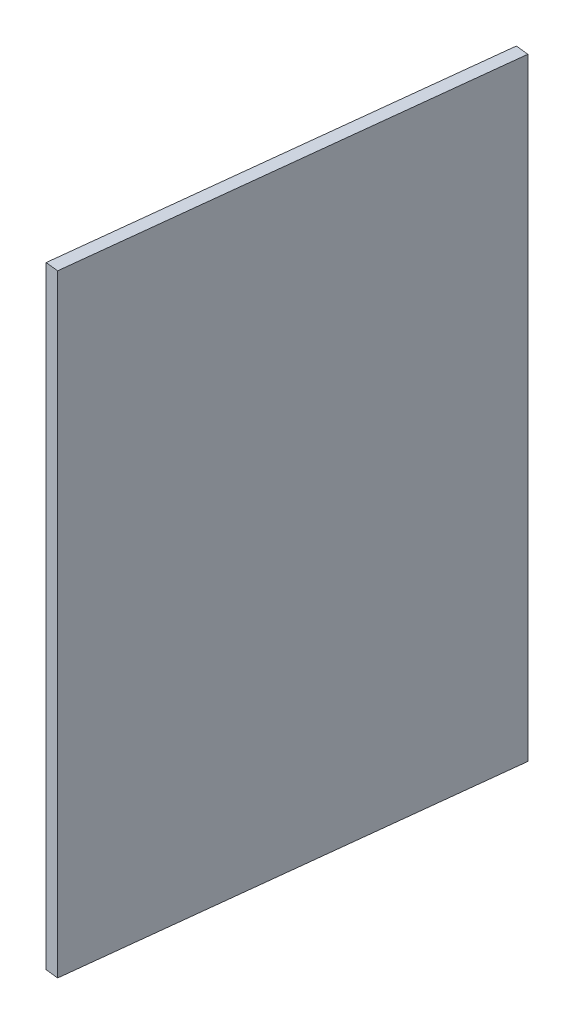
ISO-10303-21;
HEADER;
FILE_DESCRIPTION(('STEP AP214'),'2;1');
FILE_NAME('part.step','',(''),(''),'','','');
FILE_SCHEMA(('AUTOMOTIVE_DESIGN { 1 0 10303 214 1 1 1 1 }'));
ENDSEC;
DATA;
#1=APPLICATION_CONTEXT('core data for automotive mechanical design processes');
#2=APPLICATION_PROTOCOL_DEFINITION('international standard','automotive_design',2000,#1);
#3=PRODUCT_CONTEXT('',#1,'mechanical');
#4=PRODUCT('Part','Part','',(#3));
#5=PRODUCT_RELATED_PRODUCT_CATEGORY('part','',(#4));
#6=PRODUCT_DEFINITION_FORMATION('','',#4);
#7=PRODUCT_DEFINITION_CONTEXT('part definition',#1,'design');
#8=PRODUCT_DEFINITION('design','',#6,#7);
#9=PRODUCT_DEFINITION_SHAPE('','',#8);
#10=(LENGTH_UNIT() NAMED_UNIT(*) SI_UNIT(.MILLI.,.METRE.));
#11=(NAMED_UNIT(*) PLANE_ANGLE_UNIT() SI_UNIT($,.RADIAN.));
#12=(NAMED_UNIT(*) SI_UNIT($,.STERADIAN.) SOLID_ANGLE_UNIT());
#13=UNCERTAINTY_MEASURE_WITH_UNIT(LENGTH_MEASURE(1.E-05),#10,'distance_accuracy_value','');
#14=(GEOMETRIC_REPRESENTATION_CONTEXT(3) GLOBAL_UNCERTAINTY_ASSIGNED_CONTEXT((#13)) GLOBAL_UNIT_ASSIGNED_CONTEXT((#10,
#11,#12)) REPRESENTATION_CONTEXT('',''));
#15=CARTESIAN_POINT('',(0.,0.,0.));
#16=DIRECTION('',(0.,0.,1.));
#17=DIRECTION('',(1.,0.,0.));
#18=AXIS2_PLACEMENT_3D('',#15,#16,#17);
#19=CARTESIAN_POINT('',(9.63164156960607,0.,67.751071337531));
#20=DIRECTION('',(-0.993723873054748,0.,-0.111860914179491));
#21=DIRECTION('',(-0.111860914179491,0.,0.993723873054748));
#22=AXIS2_PLACEMENT_3D('',#19,#20,#21);
#23=PLANE('',#22);
#24=DIRECTION('',(0.,1.,0.));
#25=VECTOR('',#24,1.);
#26=CARTESIAN_POINT('',(11.0299029968497,-18.,55.3295229243466));
#27=LINE('',#26,#25);
#28=CARTESIAN_POINT('',(11.0299029968497,-18.,55.3295229243466));
#29=VERTEX_POINT('',#28);
#30=CARTESIAN_POINT('',(11.0299029968497,18.,55.3295229243466));
#31=VERTEX_POINT('',#30);
#32=EDGE_CURVE('E28',#29,#31,#27,.T.);
#33=ORIENTED_EDGE('',*,*,#32,.T.);
#34=DIRECTION('',(-0.111860914179491,0.,0.993723873054748));
#35=VECTOR('',#34,1.);
#36=CARTESIAN_POINT('',(11.0299029968497,18.,55.3295229243466));
#37=LINE('',#36,#35);
#38=CARTESIAN_POINT('',(8.23338014236244,18.,80.1726197507153));
#39=VERTEX_POINT('',#38);
#40=EDGE_CURVE('E71',#31,#39,#37,.T.);
#41=ORIENTED_EDGE('',*,*,#40,.T.);
#42=DIRECTION('',(0.,-1.,0.));
#43=VECTOR('',#42,1.);
#44=CARTESIAN_POINT('',(8.23338014236244,18.,80.1726197507153));
#45=LINE('',#44,#43);
#46=CARTESIAN_POINT('',(8.23338014236244,-18.,80.1726197507153));
#47=VERTEX_POINT('',#46);
#48=EDGE_CURVE('E62',#39,#47,#45,.T.);
#49=ORIENTED_EDGE('',*,*,#48,.T.);
#50=DIRECTION('',(0.111860914179491,0.,-0.993723873054748));
#51=VECTOR('',#50,1.);
#52=CARTESIAN_POINT('',(8.23338014236244,-18.,80.1726197507153));
#53=LINE('',#52,#51);
#54=EDGE_CURVE('E73',#47,#29,#53,.T.);
#55=ORIENTED_EDGE('',*,*,#54,.T.);
#56=EDGE_LOOP('',(#33,#41,#49,#55));
#57=FACE_BOUND('',#56,.T.);
#58=ADVANCED_FACE('F17',(#57),#23,.F.);
#59=CARTESIAN_POINT('',(8.8744239783384,0.,67.6658333209262));
#60=DIRECTION('',(-0.993723873054748,0.,-0.111860914179488));
#61=DIRECTION('',(-0.111860914179488,0.,0.993723873054748));
#62=AXIS2_PLACEMENT_3D('',#59,#60,#61);
#63=PLANE('',#62);
#64=DIRECTION('',(0.,-1.,0.));
#65=VECTOR('',#64,1.);
#66=CARTESIAN_POINT('',(10.272685405582,-18.,55.2442849077419));
#67=LINE('',#66,#65);
#68=CARTESIAN_POINT('',(10.272685405582,18.,55.2442849077418));
#69=VERTEX_POINT('',#68);
#70=CARTESIAN_POINT('',(10.272685405582,-18.,55.2442849077418));
#71=VERTEX_POINT('',#70);
#72=EDGE_CURVE('E11',#69,#71,#67,.T.);
#73=ORIENTED_EDGE('',*,*,#72,.T.);
#74=DIRECTION('',(-0.111860914179491,0.,0.993723873054748));
#75=VECTOR('',#74,1.);
#76=CARTESIAN_POINT('',(7.47616255109472,-18.,80.0873817341105));
#77=LINE('',#76,#75);
#78=CARTESIAN_POINT('',(7.47616255109472,-18.,80.0873817341105));
#79=VERTEX_POINT('',#78);
#80=EDGE_CURVE('E93',#71,#79,#77,.T.);
#81=ORIENTED_EDGE('',*,*,#80,.T.);
#82=DIRECTION('',(0.,1.,0.));
#83=VECTOR('',#82,1.);
#84=CARTESIAN_POINT('',(7.47616255109472,18.,80.0873817341105));
#85=LINE('',#84,#83);
#86=CARTESIAN_POINT('',(7.47616255109472,18.,80.0873817341105));
#87=VERTEX_POINT('',#86);
#88=EDGE_CURVE('E99',#79,#87,#85,.T.);
#89=ORIENTED_EDGE('',*,*,#88,.T.);
#90=DIRECTION('',(0.111860914179491,0.,-0.993723873054748));
#91=VECTOR('',#90,1.);
#92=CARTESIAN_POINT('',(10.272685405582,18.,55.2442849077419));
#93=LINE('',#92,#91);
#94=EDGE_CURVE('E84',#87,#69,#93,.T.);
#95=ORIENTED_EDGE('',*,*,#94,.T.);
#96=EDGE_LOOP('',(#73,#81,#89,#95));
#97=FACE_BOUND('',#96,.T.);
#98=ADVANCED_FACE('F113',(#97),#63,.T.);
#99=CARTESIAN_POINT('',(11.0299029968497,18.,55.3295229243466));
#100=DIRECTION('',(0.111860914179488,0.,-0.993723873054748));
#101=DIRECTION('',(0.,-1.,0.));
#102=AXIS2_PLACEMENT_3D('',#99,#100,#101);
#103=PLANE('',#102);
#104=ORIENTED_EDGE('',*,*,#32,.F.);
#105=DIRECTION('',(-0.993723873054748,0.,-0.111860914179488));
#106=VECTOR('',#105,1.);
#107=CARTESIAN_POINT('',(11.0299029968497,-18.,55.3295229243466));
#108=LINE('',#107,#106);
#109=EDGE_CURVE('E21',#29,#71,#108,.T.);
#110=ORIENTED_EDGE('',*,*,#109,.T.);
#111=ORIENTED_EDGE('',*,*,#72,.F.);
#112=DIRECTION('',(-0.993723873054748,0.,-0.111860914179488));
#113=VECTOR('',#112,1.);
#114=CARTESIAN_POINT('',(11.0299029968497,18.,55.3295229243466));
#115=LINE('',#114,#113);
#116=EDGE_CURVE('E79',#31,#69,#115,.T.);
#117=ORIENTED_EDGE('',*,*,#116,.F.);
#118=EDGE_LOOP('',(#104,#110,#111,#117));
#119=FACE_BOUND('',#118,.T.);
#120=ADVANCED_FACE('F80',(#119),#103,.T.);
#121=CARTESIAN_POINT('',(11.0299029968497,-18.,55.3295229243466));
#122=DIRECTION('',(0.,-1.,0.));
#123=DIRECTION('',(0.,0.,-1.));
#124=AXIS2_PLACEMENT_3D('',#121,#122,#123);
#125=PLANE('',#124);
#126=ORIENTED_EDGE('',*,*,#54,.F.);
#127=DIRECTION('',(-0.993723873054748,0.,-0.111860914179488));
#128=VECTOR('',#127,1.);
#129=CARTESIAN_POINT('',(8.23338014236244,-18.,80.1726197507153));
#130=LINE('',#129,#128);
#131=EDGE_CURVE('E96',#47,#79,#130,.T.);
#132=ORIENTED_EDGE('',*,*,#131,.T.);
#133=ORIENTED_EDGE('',*,*,#80,.F.);
#134=ORIENTED_EDGE('',*,*,#109,.F.);
#135=EDGE_LOOP('',(#126,#132,#133,#134));
#136=FACE_BOUND('',#135,.T.);
#137=ADVANCED_FACE('F19',(#136),#125,.T.);
#138=CARTESIAN_POINT('',(8.23338014236244,-18.,80.1726197507153));
#139=DIRECTION('',(-0.111860914179488,0.,0.993723873054748));
#140=DIRECTION('',(0.,1.,0.));
#141=AXIS2_PLACEMENT_3D('',#138,#139,#140);
#142=PLANE('',#141);
#143=ORIENTED_EDGE('',*,*,#48,.F.);
#144=DIRECTION('',(-0.993723873054748,0.,-0.111860914179488));
#145=VECTOR('',#144,1.);
#146=CARTESIAN_POINT('',(8.23338014236244,18.,80.1726197507153));
#147=LINE('',#146,#145);
#148=EDGE_CURVE('E86',#39,#87,#147,.T.);
#149=ORIENTED_EDGE('',*,*,#148,.T.);
#150=ORIENTED_EDGE('',*,*,#88,.F.);
#151=ORIENTED_EDGE('',*,*,#131,.F.);
#152=EDGE_LOOP('',(#143,#149,#150,#151));
#153=FACE_BOUND('',#152,.T.);
#154=ADVANCED_FACE('F123',(#153),#142,.T.);
#155=CARTESIAN_POINT('',(8.23338014236244,18.,80.1726197507153));
#156=DIRECTION('',(0.,1.,0.));
#157=DIRECTION('',(1.,0.,0.));
#158=AXIS2_PLACEMENT_3D('',#155,#156,#157);
#159=PLANE('',#158);
#160=ORIENTED_EDGE('',*,*,#40,.F.);
#161=ORIENTED_EDGE('',*,*,#116,.T.);
#162=ORIENTED_EDGE('',*,*,#94,.F.);
#163=ORIENTED_EDGE('',*,*,#148,.F.);
#164=EDGE_LOOP('',(#160,#161,#162,#163));
#165=FACE_BOUND('',#164,.T.);
#166=ADVANCED_FACE('F85',(#165),#159,.T.);
#167=CLOSED_SHELL('',(#58,#98,#120,#137,#154,#166));
#168=MANIFOLD_SOLID_BREP('B1',#167);
#169=ADVANCED_BREP_SHAPE_REPRESENTATION('',(#18,#168),#14);
#170=SHAPE_DEFINITION_REPRESENTATION(#9,#169);
ENDSEC;
END-ISO-10303-21;
